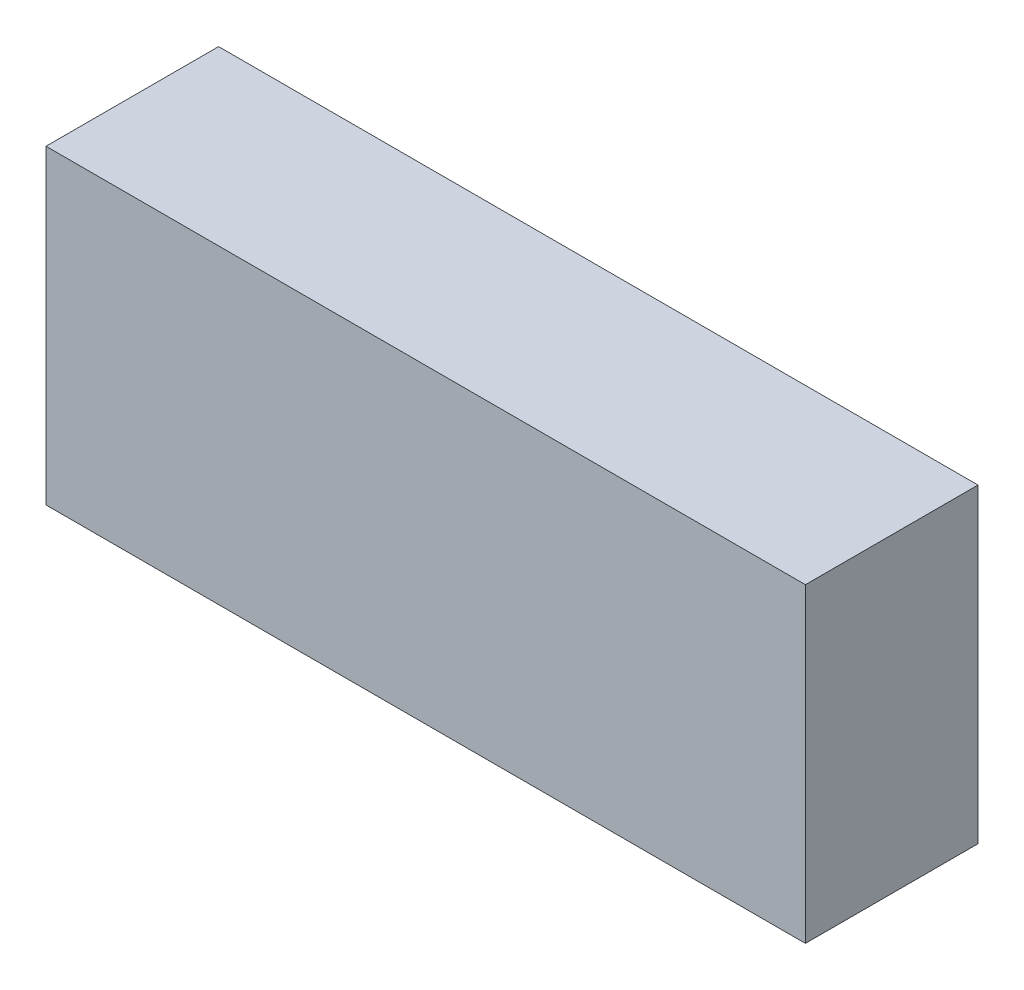
ISO-10303-21;
HEADER;
FILE_DESCRIPTION(('STEP AP214'),'2;1');
FILE_NAME('part.step','',(''),(''),'','','');
FILE_SCHEMA(('AUTOMOTIVE_DESIGN { 1 0 10303 214 1 1 1 1 }'));
ENDSEC;
DATA;
#1=APPLICATION_CONTEXT('core data for automotive mechanical design processes');
#2=APPLICATION_PROTOCOL_DEFINITION('international standard','automotive_design',2000,#1);
#3=PRODUCT_CONTEXT('',#1,'mechanical');
#4=PRODUCT('Part','Part','',(#3));
#5=PRODUCT_RELATED_PRODUCT_CATEGORY('part','',(#4));
#6=PRODUCT_DEFINITION_FORMATION('','',#4);
#7=PRODUCT_DEFINITION_CONTEXT('part definition',#1,'design');
#8=PRODUCT_DEFINITION('design','',#6,#7);
#9=PRODUCT_DEFINITION_SHAPE('','',#8);
#10=(LENGTH_UNIT() NAMED_UNIT(*) SI_UNIT(.MILLI.,.METRE.));
#11=(NAMED_UNIT(*) PLANE_ANGLE_UNIT() SI_UNIT($,.RADIAN.));
#12=(NAMED_UNIT(*) SI_UNIT($,.STERADIAN.) SOLID_ANGLE_UNIT());
#13=UNCERTAINTY_MEASURE_WITH_UNIT(LENGTH_MEASURE(1.E-05),#10,'distance_accuracy_value','');
#14=(GEOMETRIC_REPRESENTATION_CONTEXT(3) GLOBAL_UNCERTAINTY_ASSIGNED_CONTEXT((#13)) GLOBAL_UNIT_ASSIGNED_CONTEXT((#10,
#11,#12)) REPRESENTATION_CONTEXT('',''));
#15=CARTESIAN_POINT('',(0.,0.,0.));
#16=DIRECTION('',(0.,0.,1.));
#17=DIRECTION('',(1.,0.,0.));
#18=AXIS2_PLACEMENT_3D('',#15,#16,#17);
#19=CARTESIAN_POINT('',(2.21,-0.91,0.));
#20=DIRECTION('',(0.,0.,-1.));
#21=DIRECTION('',(-1.,0.,0.));
#22=AXIS2_PLACEMENT_3D('',#19,#20,#21);
#23=PLANE('',#22);
#24=DIRECTION('',(0.,-1.,0.));
#25=VECTOR('',#24,1.);
#26=CARTESIAN_POINT('',(-2.2,0.,0.));
#27=LINE('',#26,#25);
#28=CARTESIAN_POINT('',(-2.2,0.9,0.));
#29=VERTEX_POINT('',#28);
#30=CARTESIAN_POINT('',(-2.2,-0.9,0.));
#31=VERTEX_POINT('',#30);
#32=EDGE_CURVE('E68',#29,#31,#27,.T.);
#33=ORIENTED_EDGE('',*,*,#32,.F.);
#34=DIRECTION('',(-1.,0.,0.));
#35=VECTOR('',#34,1.);
#36=CARTESIAN_POINT('',(0.,0.9,0.));
#37=LINE('',#36,#35);
#38=CARTESIAN_POINT('',(2.2,0.9,0.));
#39=VERTEX_POINT('',#38);
#40=EDGE_CURVE('E55',#39,#29,#37,.T.);
#41=ORIENTED_EDGE('',*,*,#40,.F.);
#42=DIRECTION('',(0.,1.,0.));
#43=VECTOR('',#42,1.);
#44=CARTESIAN_POINT('',(2.2,0.,0.));
#45=LINE('',#44,#43);
#46=CARTESIAN_POINT('',(2.2,-0.9,0.));
#47=VERTEX_POINT('',#46);
#48=EDGE_CURVE('E20',#47,#39,#45,.T.);
#49=ORIENTED_EDGE('',*,*,#48,.F.);
#50=DIRECTION('',(1.,0.,0.));
#51=VECTOR('',#50,1.);
#52=CARTESIAN_POINT('',(0.,-0.9,0.));
#53=LINE('',#52,#51);
#54=EDGE_CURVE('E80',#31,#47,#53,.T.);
#55=ORIENTED_EDGE('',*,*,#54,.F.);
#56=EDGE_LOOP('',(#33,#41,#49,#55));
#57=FACE_BOUND('',#56,.T.);
#58=ADVANCED_FACE('F16',(#57),#23,.T.);
#59=CARTESIAN_POINT('',(2.2,-0.91,1.01));
#60=DIRECTION('',(1.,0.,0.));
#61=DIRECTION('',(0.,0.,-1.));
#62=AXIS2_PLACEMENT_3D('',#59,#60,#61);
#63=PLANE('',#62);
#64=DIRECTION('',(0.,0.,-1.));
#65=VECTOR('',#64,1.);
#66=CARTESIAN_POINT('',(2.2,0.9,0.5));
#67=LINE('',#66,#65);
#68=CARTESIAN_POINT('',(2.2,0.9,1.));
#69=VERTEX_POINT('',#68);
#70=EDGE_CURVE('E61',#69,#39,#67,.T.);
#71=ORIENTED_EDGE('',*,*,#70,.F.);
#72=DIRECTION('',(0.,1.,0.));
#73=VECTOR('',#72,1.);
#74=CARTESIAN_POINT('',(2.2,0.,1.));
#75=LINE('',#74,#73);
#76=CARTESIAN_POINT('',(2.2,-0.9,1.));
#77=VERTEX_POINT('',#76);
#78=EDGE_CURVE('E83',#77,#69,#75,.T.);
#79=ORIENTED_EDGE('',*,*,#78,.F.);
#80=DIRECTION('',(0.,0.,1.));
#81=VECTOR('',#80,1.);
#82=CARTESIAN_POINT('',(2.2,-0.9,0.5));
#83=LINE('',#82,#81);
#84=EDGE_CURVE('E64',#47,#77,#83,.T.);
#85=ORIENTED_EDGE('',*,*,#84,.F.);
#86=ORIENTED_EDGE('',*,*,#48,.T.);
#87=EDGE_LOOP('',(#71,#79,#85,#86));
#88=FACE_BOUND('',#87,.T.);
#89=ADVANCED_FACE('F60',(#88),#63,.T.);
#90=CARTESIAN_POINT('',(-2.21,0.9,-0.01));
#91=DIRECTION('',(0.,1.,0.));
#92=DIRECTION('',(0.,0.,1.));
#93=AXIS2_PLACEMENT_3D('',#90,#91,#92);
#94=PLANE('',#93);
#95=DIRECTION('',(0.,0.,-1.));
#96=VECTOR('',#95,1.);
#97=CARTESIAN_POINT('',(-2.2,0.9,0.5));
#98=LINE('',#97,#96);
#99=CARTESIAN_POINT('',(-2.2,0.9,1.));
#100=VERTEX_POINT('',#99);
#101=EDGE_CURVE('E70',#100,#29,#98,.T.);
#102=ORIENTED_EDGE('',*,*,#101,.F.);
#103=DIRECTION('',(-1.,0.,0.));
#104=VECTOR('',#103,1.);
#105=CARTESIAN_POINT('',(0.,0.9,1.));
#106=LINE('',#105,#104);
#107=EDGE_CURVE('E74',#69,#100,#106,.T.);
#108=ORIENTED_EDGE('',*,*,#107,.F.);
#109=ORIENTED_EDGE('',*,*,#70,.T.);
#110=ORIENTED_EDGE('',*,*,#40,.T.);
#111=EDGE_LOOP('',(#102,#108,#109,#110));
#112=FACE_BOUND('',#111,.T.);
#113=ADVANCED_FACE('F72',(#112),#94,.T.);
#114=CARTESIAN_POINT('',(-2.2,-0.91,-0.01));
#115=DIRECTION('',(-1.,0.,0.));
#116=DIRECTION('',(0.,0.,1.));
#117=AXIS2_PLACEMENT_3D('',#114,#115,#116);
#118=PLANE('',#117);
#119=DIRECTION('',(0.,0.,-1.));
#120=VECTOR('',#119,1.);
#121=CARTESIAN_POINT('',(-2.2,-0.9,0.5));
#122=LINE('',#121,#120);
#123=CARTESIAN_POINT('',(-2.2,-0.9,1.));
#124=VERTEX_POINT('',#123);
#125=EDGE_CURVE('E35',#124,#31,#122,.T.);
#126=ORIENTED_EDGE('',*,*,#125,.F.);
#127=DIRECTION('',(0.,-1.,0.));
#128=VECTOR('',#127,1.);
#129=CARTESIAN_POINT('',(-2.2,0.,1.));
#130=LINE('',#129,#128);
#131=EDGE_CURVE('E26',#100,#124,#130,.T.);
#132=ORIENTED_EDGE('',*,*,#131,.F.);
#133=ORIENTED_EDGE('',*,*,#101,.T.);
#134=ORIENTED_EDGE('',*,*,#32,.T.);
#135=EDGE_LOOP('',(#126,#132,#133,#134));
#136=FACE_BOUND('',#135,.T.);
#137=ADVANCED_FACE('F88',(#136),#118,.T.);
#138=CARTESIAN_POINT('',(-2.21,-0.9,1.01));
#139=DIRECTION('',(0.,-1.,0.));
#140=DIRECTION('',(0.,0.,-1.));
#141=AXIS2_PLACEMENT_3D('',#138,#139,#140);
#142=PLANE('',#141);
#143=ORIENTED_EDGE('',*,*,#84,.T.);
#144=DIRECTION('',(1.,0.,0.));
#145=VECTOR('',#144,1.);
#146=CARTESIAN_POINT('',(0.,-0.9,1.));
#147=LINE('',#146,#145);
#148=EDGE_CURVE('E11',#124,#77,#147,.T.);
#149=ORIENTED_EDGE('',*,*,#148,.F.);
#150=ORIENTED_EDGE('',*,*,#125,.T.);
#151=ORIENTED_EDGE('',*,*,#54,.T.);
#152=EDGE_LOOP('',(#143,#149,#150,#151));
#153=FACE_BOUND('',#152,.T.);
#154=ADVANCED_FACE('F90',(#153),#142,.T.);
#155=CARTESIAN_POINT('',(-2.21,-0.91,1.));
#156=DIRECTION('',(0.,0.,1.));
#157=DIRECTION('',(1.,0.,0.));
#158=AXIS2_PLACEMENT_3D('',#155,#156,#157);
#159=PLANE('',#158);
#160=ORIENTED_EDGE('',*,*,#131,.T.);
#161=ORIENTED_EDGE('',*,*,#148,.T.);
#162=ORIENTED_EDGE('',*,*,#78,.T.);
#163=ORIENTED_EDGE('',*,*,#107,.T.);
#164=EDGE_LOOP('',(#160,#161,#162,#163));
#165=FACE_BOUND('',#164,.T.);
#166=ADVANCED_FACE('F18',(#165),#159,.T.);
#167=CLOSED_SHELL('',(#58,#89,#113,#137,#154,#166));
#168=MANIFOLD_SOLID_BREP('B1',#167);
#169=ADVANCED_BREP_SHAPE_REPRESENTATION('',(#18,#168),#14);
#170=SHAPE_DEFINITION_REPRESENTATION(#9,#169);
ENDSEC;
END-ISO-10303-21;
